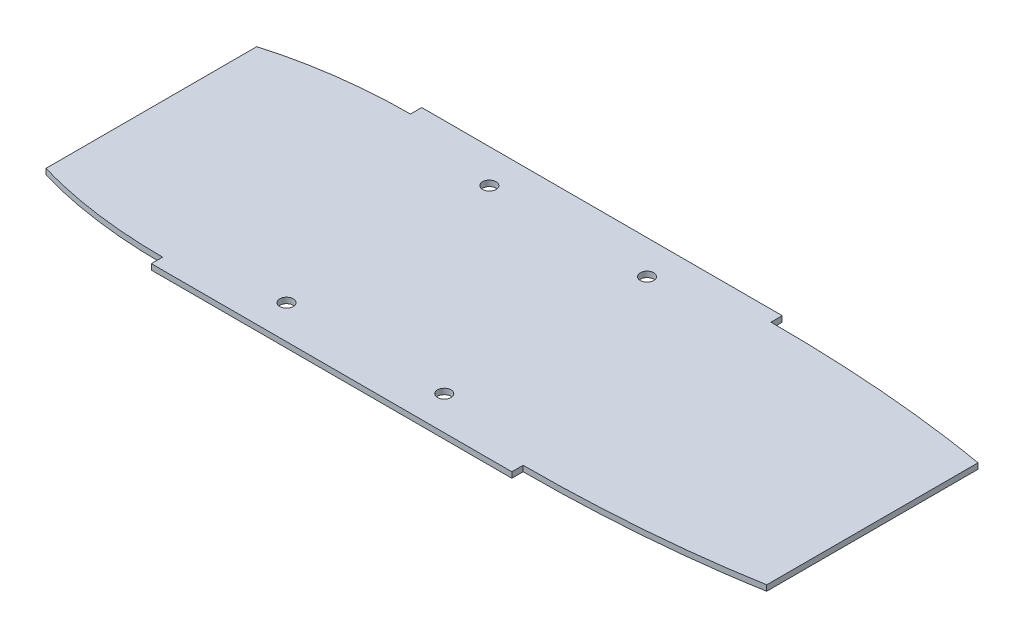
ISO-10303-21;
HEADER;
FILE_DESCRIPTION(('STEP AP214'),'2;1');
FILE_NAME('part.step','',(''),(''),'','','');
FILE_SCHEMA(('AUTOMOTIVE_DESIGN { 1 0 10303 214 1 1 1 1 }'));
ENDSEC;
DATA;
#1=APPLICATION_CONTEXT('core data for automotive mechanical design processes');
#2=APPLICATION_PROTOCOL_DEFINITION('international standard','automotive_design',2000,#1);
#3=PRODUCT_CONTEXT('',#1,'mechanical');
#4=PRODUCT('Part','Part','',(#3));
#5=PRODUCT_RELATED_PRODUCT_CATEGORY('part','',(#4));
#6=PRODUCT_DEFINITION_FORMATION('','',#4);
#7=PRODUCT_DEFINITION_CONTEXT('part definition',#1,'design');
#8=PRODUCT_DEFINITION('design','',#6,#7);
#9=PRODUCT_DEFINITION_SHAPE('','',#8);
#10=(LENGTH_UNIT() NAMED_UNIT(*) SI_UNIT(.MILLI.,.METRE.));
#11=(NAMED_UNIT(*) PLANE_ANGLE_UNIT() SI_UNIT($,.RADIAN.));
#12=(NAMED_UNIT(*) SI_UNIT($,.STERADIAN.) SOLID_ANGLE_UNIT());
#13=UNCERTAINTY_MEASURE_WITH_UNIT(LENGTH_MEASURE(1.E-05),#10,'distance_accuracy_value','');
#14=(GEOMETRIC_REPRESENTATION_CONTEXT(3) GLOBAL_UNCERTAINTY_ASSIGNED_CONTEXT((#13)) GLOBAL_UNIT_ASSIGNED_CONTEXT((#10,
#11,#12)) REPRESENTATION_CONTEXT('',''));
#15=CARTESIAN_POINT('',(0.,0.,0.));
#16=DIRECTION('',(0.,0.,1.));
#17=DIRECTION('',(1.,0.,0.));
#18=AXIS2_PLACEMENT_3D('',#15,#16,#17);
#19=CARTESIAN_POINT('',(76.1999999999997,26.9875,-34.925));
#20=CARTESIAN_POINT('',(72.5603564632113,26.9875,-34.925));
#21=CARTESIAN_POINT('',(68.9433602687617,26.9875,-34.7925618992713));
#22=CARTESIAN_POINT('',(61.754441862427,26.9875,-34.2641001276463));
#23=CARTESIAN_POINT('',(58.1825049464731,26.9875,-33.868162443835));
#24=CARTESIAN_POINT('',(51.0865374538094,26.9875,-32.7961383290664));
#25=CARTESIAN_POINT('',(47.5624441070245,26.9875,-32.1204189676496));
#26=CARTESIAN_POINT('',(40.56908339934,26.9875,-30.4483664909969));
#27=CARTESIAN_POINT('',(37.0996317653239,26.9875,-29.4531109760018));
#28=CARTESIAN_POINT('',(32.8060272774813,26.9875,-27.956355969603));
#29=CARTESIAN_POINT('',(31.949494881953,26.9875,-27.6442069521447));
#30=CARTESIAN_POINT('',(30.2411749515847,26.9875,-26.992161717209));
#31=CARTESIAN_POINT('',(29.3909262644994,26.9875,-26.6527975495949));
#32=CARTESIAN_POINT('',(26.8661441131601,26.9875,-25.597394737503));
#33=CARTESIAN_POINT('',(25.2123734643618,26.9875,-24.8423540741429));
#34=CARTESIAN_POINT('',(21.9728214093303,26.9875,-23.213388070859));
#35=CARTESIAN_POINT('',(20.386939208928,26.9875,-22.339638977673));
#36=CARTESIAN_POINT('',(17.297386896949,26.9875,-20.4483863204334));
#37=CARTESIAN_POINT('',(15.7934781724047,26.9875,-19.431299990407));
#38=CARTESIAN_POINT('',(13.6172991220065,26.9875,-17.7663365281185));
#39=CARTESIAN_POINT('',(12.9046822744669,26.9875,-17.1874406169234));
#40=CARTESIAN_POINT('',(11.5135618934957,26.9875,-15.9764993076084));
#41=CARTESIAN_POINT('',(10.8408805125964,26.9875,-15.3495523852048));
#42=CARTESIAN_POINT('',(9.54783146962513,26.9875,-14.0465518144513));
#43=CARTESIAN_POINT('',(8.9274235452261,26.9875,-13.3705359602233));
#44=CARTESIAN_POINT('',(8.0428892774231,26.9875,-12.3132592607334));
#45=CARTESIAN_POINT('',(7.75574806179347,26.9875,-11.9536024047961));
#46=CARTESIAN_POINT('',(7.19839537483305,26.9875,-11.2183967943476));
#47=CARTESIAN_POINT('',(6.92844663374853,26.9875,-10.8430707322873));
#48=CARTESIAN_POINT('',(5.63796184227502,26.9875,-8.94213359665423));
#49=CARTESIAN_POINT('',(4.78101107586467,26.9875,-7.33176742386425));
#50=CARTESIAN_POINT('',(4.01147969438286,26.9875,-5.16471775272271));
#51=CARTESIAN_POINT('',(3.87239307522746,26.9875,-4.72142751827261));
#52=CARTESIAN_POINT('',(3.63099177501125,26.9875,-3.82846626814824));
#53=CARTESIAN_POINT('',(3.52874667724679,26.9875,-3.37975212502372));
#54=CARTESIAN_POINT('',(3.27869346703287,26.9875,-2.02674994666996));
#55=CARTESIAN_POINT('',(3.18749456265522,26.9875,-1.11561098190104));
#56=CARTESIAN_POINT('',(3.17054554415629,26.9875,0.265601808246156));
#57=CARTESIAN_POINT('',(3.18510372384195,26.9875,0.730659271986201));
#58=CARTESIAN_POINT('',(3.25443229426314,26.9875,1.65360842255518));
#59=CARTESIAN_POINT('',(3.30889651317539,26.9875,2.11072274199884));
#60=CARTESIAN_POINT('',(3.52864851104458,26.9875,3.46965448976416));
#61=CARTESIAN_POINT('',(3.75017780345977,26.9875,4.35908665502137));
#62=CARTESIAN_POINT('',(4.18515546351808,26.9875,5.67062233748688));
#63=CARTESIAN_POINT('',(4.34801748654266,26.9875,6.1056829349753));
#64=CARTESIAN_POINT('',(4.70275321201352,26.9875,6.9593140984271));
#65=CARTESIAN_POINT('',(4.89428858014908,26.9875,7.37754006923282));
#66=CARTESIAN_POINT('',(5.507317523469,26.9875,8.60892261472479));
#67=CARTESIAN_POINT('',(5.96705377573498,26.9875,9.39889305272723));
#68=CARTESIAN_POINT('',(6.97247279095451,26.9875,10.9267254547347));
#69=CARTESIAN_POINT('',(7.51823247837097,26.9875,11.6645407802393));
#70=CARTESIAN_POINT('',(8.68466075580004,26.9875,13.0947549440418));
#71=CARTESIAN_POINT('',(9.29981778787903,26.9875,13.7801786538996));
#72=CARTESIAN_POINT('',(11.2121251615962,26.9875,15.748333856865));
#73=CARTESIAN_POINT('',(12.5810595129363,26.9875,16.9509905777263));
#74=CARTESIAN_POINT('',(14.7394801665955,26.9875,18.6327806396098));
#75=CARTESIAN_POINT('',(15.4767122291943,26.9875,19.1727144085212));
#76=CARTESIAN_POINT('',(16.9829097552736,26.9875,20.2156585433375));
#77=CARTESIAN_POINT('',(17.7537573162849,26.9875,20.7197626436659));
#78=CARTESIAN_POINT('',(20.0906862626501,26.9875,22.1703092783181));
#79=CARTESIAN_POINT('',(21.6832083273336,26.9875,23.0576952616506));
#80=CARTESIAN_POINT('',(26.5434665049421,26.9875,25.5293377442829));
#81=CARTESIAN_POINT('',(29.8928013186441,26.9875,26.9255976090118));
#82=CARTESIAN_POINT('',(35.0379302371644,26.9875,28.7409215465057));
#83=CARTESIAN_POINT('',(36.7735475740316,26.9875,29.2986278984547));
#84=CARTESIAN_POINT('',(39.4049565803212,26.9875,30.070716914458));
#85=CARTESIAN_POINT('',(40.2864570684969,26.9875,30.3171837285658));
#86=CARTESIAN_POINT('',(42.0503516596852,26.9875,30.7873971555794));
#87=CARTESIAN_POINT('',(42.9337641271586,26.9875,31.0114480762167));
#88=CARTESIAN_POINT('',(47.3577772856146,26.9875,32.0792536532369));
#89=CARTESIAN_POINT('',(50.9190458063632,26.9875,32.7670544258513));
#90=CARTESIAN_POINT('',(58.0795392874728,26.9875,33.856246888046));
#91=CARTESIAN_POINT('',(61.6788220684616,26.9875,34.2572022787228));
#92=CARTESIAN_POINT('',(68.9128349065164,26.9875,34.7916374501152));
#93=CARTESIAN_POINT('',(72.5475804996293,26.9875,34.925));
#94=CARTESIAN_POINT('',(76.1999999999997,26.9875,34.925));
#95=B_SPLINE_CURVE_WITH_KNOTS('',3,(#19,#20,#21,#22,#23,#24,#25,#26,#27,#28,#29,#30,#31,#32,#33,
#34,#35,#36,#37,#38,#39,#40,#41,#42,#43,#44,#45,#46,#47,#48,#49,#50,#51,#52,#53,#54,#55,#56,#57,
#58,#59,#60,#61,#62,#63,#64,#65,#66,#67,#68,#69,#70,#71,#72,#73,#74,#75,#76,#77,#78,#79,#80,#81,
#82,#83,#84,#85,#86,#87,#88,#89,#90,#91,#92,#93,#94),.UNSPECIFIED.,.F.,.F.,(4,2,2,2,2,2,2,2,2,2,
2,2,2,2,2,2,2,2,2,2,2,2,2,2,2,2,2,2,2,2,2,2,2,2,2,2,2,4),(0.,0.0625,0.125,0.1875,0.25,0.265625,
0.28125,0.3125,0.34375,0.375,0.390625,0.40625,0.421875,0.4296875,0.4375,0.46875,0.4765625,
0.484375,0.5,0.5078125,0.515625,0.53125,0.5390625,0.546875,0.5625,0.578125,0.59375,0.625,
0.640625,0.65625,0.6875,0.75,0.78125,0.796875,0.8125,0.875,0.9375,1.),.UNSPECIFIED.);
#96=DIRECTION('',(0.,-1.,0.));
#97=VECTOR('',#96,1.);
#98=SURFACE_OF_LINEAR_EXTRUSION('',#95,#97);
#99=CARTESIAN_POINT('',(76.1999999999997,25.4,-34.925));
#100=CARTESIAN_POINT('',(72.5603564632113,25.4,-34.925));
#101=CARTESIAN_POINT('',(68.9433602687617,25.4,-34.7925618992713));
#102=CARTESIAN_POINT('',(61.754441862427,25.4,-34.2641001276463));
#103=CARTESIAN_POINT('',(58.1825049464731,25.4,-33.868162443835));
#104=CARTESIAN_POINT('',(51.0865374538094,25.4,-32.7961383290664));
#105=CARTESIAN_POINT('',(47.5624441070245,25.4,-32.1204189676496));
#106=CARTESIAN_POINT('',(42.0678176520532,25.4,-30.8067009776393));
#107=CARTESIAN_POINT('',(40.0787611646926,25.4,-30.277024160949));
#108=CARTESIAN_POINT('',(38.0999634049355,25.4,-29.6873559165939));
#109=B_SPLINE_CURVE_WITH_KNOTS('',3,(#99,#100,#101,#102,#103,#104,#105,#106,#107,#108),
.UNSPECIFIED.,.F.,.F.,(4,2,2,2,4),(0.,0.0625,0.125,0.1875,0.223211480228198),.UNSPECIFIED.);
#110=CARTESIAN_POINT('',(76.1999999999997,25.4,-34.925));
#111=VERTEX_POINT('',#110);
#112=CARTESIAN_POINT('',(38.0999999999997,25.4,-29.6872331160952));
#113=VERTEX_POINT('',#112);
#114=EDGE_CURVE('E403',#111,#113,#109,.T.);
#115=ORIENTED_EDGE('',*,*,#114,.T.);
#116=DIRECTION('',(0.,-1.,0.));
#117=VECTOR('',#116,1.);
#118=CARTESIAN_POINT('',(38.0999999999997,26.9875,-29.6873668216664));
#119=LINE('',#118,#117);
#120=CARTESIAN_POINT('',(38.0999999980856,26.9875,-29.6871628381416));
#121=VERTEX_POINT('',#120);
#122=EDGE_CURVE('E11',#113,#121,#119,.F.);
#123=ORIENTED_EDGE('',*,*,#122,.T.);
#124=CARTESIAN_POINT('',(38.0999627774147,26.9875,-29.6873557295969));
#125=CARTESIAN_POINT('',(40.0787607441765,26.9875,-30.2770240489674));
#126=CARTESIAN_POINT('',(42.0678174408555,26.9875,-30.8067009271438));
#127=CARTESIAN_POINT('',(47.5624441070245,26.9875,-32.1204189676496));
#128=CARTESIAN_POINT('',(51.0865374538094,26.9875,-32.7961383290664));
#129=CARTESIAN_POINT('',(58.1825049464731,26.9875,-33.868162443835));
#130=CARTESIAN_POINT('',(61.754441862427,26.9875,-34.2641001276463));
#131=CARTESIAN_POINT('',(68.9433602687617,26.9875,-34.7925618992713));
#132=CARTESIAN_POINT('',(72.5603564632113,26.9875,-34.925));
#133=CARTESIAN_POINT('',(76.1999999999997,26.9875,-34.925));
#134=B_SPLINE_CURVE_WITH_KNOTS('',3,(#124,#125,#126,#127,#128,#129,#130,#131,#132,#133),
.UNSPECIFIED.,.F.,.F.,(4,2,2,2,4),(0.,0.0357114840031659,0.098211484003166,0.160711484003166,
0.223211484003166),.UNSPECIFIED.);
#135=CARTESIAN_POINT('',(76.1999999999997,26.9875,-34.925));
#136=VERTEX_POINT('',#135);
#137=EDGE_CURVE('E390',#136,#121,#134,.F.);
#138=ORIENTED_EDGE('',*,*,#137,.F.);
#139=DIRECTION('',(0.,-1.,0.));
#140=VECTOR('',#139,1.);
#141=CARTESIAN_POINT('',(76.1999999999997,26.9875,-34.925));
#142=LINE('',#141,#140);
#143=EDGE_CURVE('E218',#136,#111,#142,.T.);
#144=ORIENTED_EDGE('',*,*,#143,.T.);
#145=EDGE_LOOP('',(#115,#123,#138,#144));
#146=FACE_BOUND('',#145,.T.);
#147=ADVANCED_FACE('F41',(#146),#98,.F.);
#148=CARTESIAN_POINT('',(177.8,26.9875,34.925));
#149=CARTESIAN_POINT('',(183.40370840029,26.9875,34.925));
#150=CARTESIAN_POINT('',(188.998492342091,26.9875,34.8134012686547));
#151=CARTESIAN_POINT('',(200.169898566388,26.9875,34.3630955572989));
#152=CARTESIAN_POINT('',(205.746528757201,26.9875,34.0244874693774));
#153=CARTESIAN_POINT('',(216.88025562911,26.9875,33.1030083047877));
#154=CARTESIAN_POINT('',(222.437375795057,26.9875,32.5204309019362));
#155=CARTESIAN_POINT('',(230.756257159578,26.9875,31.4364978015171));
#156=CARTESIAN_POINT('',(233.526404303454,26.9875,31.0400068257652));
#157=CARTESIAN_POINT('',(239.060480939295,26.9875,30.1692742671898));
#158=CARTESIAN_POINT('',(241.826062226285,26.9875,29.6947144052508));
#159=CARTESIAN_POINT('',(250.088902803076,26.9875,28.1436304406752));
#160=CARTESIAN_POINT('',(255.558584052763,26.9875,26.9422744616829));
#161=CARTESIAN_POINT('',(262.328557631232,26.9875,25.151722447159));
#162=CARTESIAN_POINT('',(263.679135198158,26.9875,24.7789077819295));
#163=CARTESIAN_POINT('',(266.372677583537,26.9875,24.0005201906466));
#164=CARTESIAN_POINT('',(267.716821630011,26.9875,23.5945739067691));
#165=CARTESIAN_POINT('',(271.725857041584,26.9875,22.3245800424065));
#166=CARTESIAN_POINT('',(274.367439530104,26.9875,21.4093876064713));
#167=CARTESIAN_POINT('',(279.569151408405,26.9875,19.3995631096485));
#168=CARTESIAN_POINT('',(282.129804396612,26.9875,18.3060845261203));
#169=CARTESIAN_POINT('',(285.882964579781,26.9875,16.4724024076561));
#170=CARTESIAN_POINT('',(287.119225285846,26.9875,15.8285870242359));
#171=CARTESIAN_POINT('',(289.553724570188,26.9875,14.4571942341488));
#172=CARTESIAN_POINT('',(290.75211294571,26.9875,13.729946827958));
#173=CARTESIAN_POINT('',(293.096789788384,26.9875,12.1606769098726));
#174=CARTESIAN_POINT('',(294.246150852308,26.9875,11.3161373275131));
#175=CARTESIAN_POINT('',(295.874693946631,26.9875,9.95117365154913));
#176=CARTESIAN_POINT('',(296.402758108851,26.9875,9.47890107028839));
#177=CARTESIAN_POINT('',(297.421867433967,26.9875,8.49107384687561));
#178=CARTESIAN_POINT('',(297.913370928572,26.9875,7.97472076560551));
#179=CARTESIAN_POINT('',(298.834097865123,26.9875,6.90284501572136));
#180=CARTESIAN_POINT('',(299.265206404791,26.9875,6.34585567960606));
#181=CARTESIAN_POINT('',(300.051083084041,26.9875,5.17694346130733));
#182=CARTESIAN_POINT('',(300.406626858853,26.9875,4.56434570485596));
#183=CARTESIAN_POINT('',(301.008906585507,26.9875,3.2658774791787));
#184=CARTESIAN_POINT('',(301.246986609035,26.9875,2.59779289203812));
#185=CARTESIAN_POINT('',(301.485043085,26.9875,1.56007434835118));
#186=CARTESIAN_POINT('',(301.544634961144,26.9875,1.20611376411271));
#187=CARTESIAN_POINT('',(301.61783011653,26.9875,0.494585391032958));
#188=CARTESIAN_POINT('',(301.644885041487,26.9875,-0.214202136822748));
#189=CARTESIAN_POINT('',(301.58142305175,26.9875,-0.917612733288204));
#190=CARTESIAN_POINT('',(301.474094585222,26.9875,-1.61841755118926));
#191=CARTESIAN_POINT('',(301.397802991621,26.9875,-1.96980161308525));
#192=CARTESIAN_POINT('',(301.111287523074,26.9875,-3.00150338244735));
#193=CARTESIAN_POINT('',(300.846416268115,26.9875,-3.65704054032108));
#194=CARTESIAN_POINT('',(300.206739898206,26.9875,-4.92009342119564));
#195=CARTESIAN_POINT('',(299.828668716882,26.9875,-5.53104392505531));
#196=CARTESIAN_POINT('',(299.007148253441,26.9875,-6.68638382324302));
#197=CARTESIAN_POINT('',(298.562585264128,26.9875,-7.23408209409014));
#198=CARTESIAN_POINT('',(297.622788001943,26.9875,-8.28455024782695));
#199=CARTESIAN_POINT('',(297.12740422262,26.9875,-8.78718756877281));
#200=CARTESIAN_POINT('',(296.096077791606,26.9875,-9.75650013066857));
#201=CARTESIAN_POINT('',(295.558527194094,26.9875,-10.22423915677));
#202=CARTESIAN_POINT('',(293.916424424212,26.9875,-11.5661588413414));
#203=CARTESIAN_POINT('',(292.777517595788,26.9875,-12.3858483534018));
#204=CARTESIAN_POINT('',(290.439906755949,26.9875,-13.9237998549299));
#205=CARTESIAN_POINT('',(289.240807105044,26.9875,-14.6413907637318));
#206=CARTESIAN_POINT('',(286.797257835421,26.9875,-15.9996503141842));
#207=CARTESIAN_POINT('',(285.552669877377,26.9875,-16.6400843057307));
#208=CARTESIAN_POINT('',(283.027180156828,26.9875,-17.8593570925605));
#209=CARTESIAN_POINT('',(281.744712958145,26.9875,-18.4387322654086));
#210=CARTESIAN_POINT('',(279.156163214264,26.9875,-19.543403236427));
#211=CARTESIAN_POINT('',(277.854905585361,26.9875,-20.0667037940368));
#212=CARTESIAN_POINT('',(273.933809614949,26.9875,-21.5645745356882));
#213=CARTESIAN_POINT('',(271.296832059148,26.9875,-22.4678783339887));
#214=CARTESIAN_POINT('',(265.988924803845,26.9875,-24.1333098808428));
#215=CARTESIAN_POINT('',(263.317871138284,26.9875,-24.8949221674372));
#216=CARTESIAN_POINT('',(255.263773485536,26.9875,-27.0095407504629));
#217=CARTESIAN_POINT('',(249.840327560234,26.9875,-28.194552175184));
#218=CARTESIAN_POINT('',(238.914613399224,26.9875,-30.2368248091202));
#219=CARTESIAN_POINT('',(233.411910816065,26.9875,-31.0922799627863));
#220=CARTESIAN_POINT('',(225.10878593395,26.9875,-32.1714210563456));
#221=CARTESIAN_POINT('',(222.333695525846,26.9875,-32.4966399737648));
#222=CARTESIAN_POINT('',(216.783621707619,26.9875,-33.0815336608464));
#223=CARTESIAN_POINT('',(214.006661760514,26.9875,-33.3414621593897));
#224=CARTESIAN_POINT('',(205.67035735836,26.9875,-34.0295189727522));
#225=CARTESIAN_POINT('',(200.105614732871,26.9875,-34.3663648638733));
#226=CARTESIAN_POINT('',(188.962770447655,26.9875,-34.8141569570662));
#227=CARTESIAN_POINT('',(183.384662687404,26.9875,-34.925));
#228=CARTESIAN_POINT('',(177.8,26.9875,-34.925));
#229=B_SPLINE_CURVE_WITH_KNOTS('',3,(#148,#149,#150,#151,#152,#153,#154,#155,#156,#157,#158,
#159,#160,#161,#162,#163,#164,#165,#166,#167,#168,#169,#170,#171,#172,#173,#174,#175,#176,#177,
#178,#179,#180,#181,#182,#183,#184,#185,#186,#187,#188,#189,#190,#191,#192,#193,#194,#195,#196,
#197,#198,#199,#200,#201,#202,#203,#204,#205,#206,#207,#208,#209,#210,#211,#212,#213,#214,#215,
#216,#217,#218,#219,#220,#221,#222,#223,#224,#225,#226,#227,#228),.UNSPECIFIED.,.F.,.F.,(4,2,2,
2,2,2,2,2,2,2,2,2,2,2,2,2,2,2,2,2,1,2,2,2,2,2,2,2,2,2,2,2,2,2,2,2,2,2,2,2,4),(0.,0.0625,0.125,
0.1875,0.21875,0.25,0.312499999999999,0.328124999999999,0.343749999999999,0.374999999999999,
0.406249999999999,0.421874999999999,0.4375,0.453125,0.4609375,0.468749999999999,
0.476562499999999,0.484374999999999,0.492187499999999,0.496093749999999,0.499999999999999,
0.503906249999999,0.507812499999998,0.515624999999998,0.523437499999998,0.531249999999998,
0.539062499999998,0.546874999999997,0.562499999999997,0.578124999999998,0.593749999999998,
0.609374999999998,0.624999999999998,0.656249999999998,0.687499999999998,0.749999999999999,
0.812499999999999,0.843749999999999,0.875,0.9375,1.),.UNSPECIFIED.);
#230=DIRECTION('',(0.,-1.,0.));
#231=VECTOR('',#230,1.);
#232=SURFACE_OF_LINEAR_EXTRUSION('',#229,#231);
#233=CARTESIAN_POINT('',(177.8,25.4,34.925));
#234=CARTESIAN_POINT('',(183.40370840029,25.4,34.925));
#235=CARTESIAN_POINT('',(188.998492342091,25.4,34.8134012686547));
#236=CARTESIAN_POINT('',(200.169898566388,25.4,34.3630955572989));
#237=CARTESIAN_POINT('',(205.746528757201,25.4,34.0244874693774));
#238=CARTESIAN_POINT('',(216.88025562911,25.4,33.1030083047877));
#239=CARTESIAN_POINT('',(222.437375795057,25.4,32.5204309019362));
#240=CARTESIAN_POINT('',(230.756257159578,25.4,31.4364978015171));
#241=CARTESIAN_POINT('',(233.526404303454,25.4,31.0400068257652));
#242=CARTESIAN_POINT('',(237.963545467979,25.4,30.3418662807057));
#243=CARTESIAN_POINT('',(239.633117521986,25.4,30.0648138942086));
#244=CARTESIAN_POINT('',(241.29999427862,25.4,29.7727633829904));
#245=B_SPLINE_CURVE_WITH_KNOTS('',3,(#233,#234,#235,#236,#237,#238,#239,#240,#241,#242,#243,
#244),.UNSPECIFIED.,.F.,.F.,(4,2,2,2,2,4),(0.,0.0625,0.125,0.1875,0.21875,0.237611579768657),.UNSPECIFIED.);
#246=CARTESIAN_POINT('',(177.8,25.4,34.925));
#247=VERTEX_POINT('',#246);
#248=CARTESIAN_POINT('',(241.3,25.4,29.7727960401112));
#249=VERTEX_POINT('',#248);
#250=EDGE_CURVE('E145',#247,#249,#245,.T.);
#251=ORIENTED_EDGE('',*,*,#250,.T.);
#252=DIRECTION('',(0.,-1.,0.));
#253=VECTOR('',#252,1.);
#254=CARTESIAN_POINT('',(241.3,26.9875,29.7727623805576));
#255=LINE('',#254,#253);
#256=CARTESIAN_POINT('',(241.300000000617,26.9875,29.7728081533494));
#257=VERTEX_POINT('',#256);
#258=EDGE_CURVE('E130',#249,#257,#255,.F.);
#259=ORIENTED_EDGE('',*,*,#258,.T.);
#260=CARTESIAN_POINT('',(241.299994813956,26.9875,29.7727632891952));
#261=CARTESIAN_POINT('',(239.633117879454,26.9875,30.0648138348896));
#262=CARTESIAN_POINT('',(237.96354564677,26.9875,30.3418662525748));
#263=CARTESIAN_POINT('',(233.526404303454,26.9875,31.0400068257652));
#264=CARTESIAN_POINT('',(230.756257159578,26.9875,31.4364978015171));
#265=CARTESIAN_POINT('',(222.437375795057,26.9875,32.5204309019362));
#266=CARTESIAN_POINT('',(216.88025562911,26.9875,33.1030083047877));
#267=CARTESIAN_POINT('',(205.746528757201,26.9875,34.0244874693774));
#268=CARTESIAN_POINT('',(200.169898566388,26.9875,34.3630955572989));
#269=CARTESIAN_POINT('',(188.998492342091,26.9875,34.8134012686547));
#270=CARTESIAN_POINT('',(183.40370840029,26.9875,34.925));
#271=CARTESIAN_POINT('',(177.8,26.9875,34.925));
#272=B_SPLINE_CURVE_WITH_KNOTS('',3,(#260,#261,#262,#263,#264,#265,#266,#267,#268,#269,#270,
#271),.UNSPECIFIED.,.F.,.F.,(4,2,2,2,2,4),(0.,0.0188615817878592,0.0501115817878591,
0.112611581787859,0.175111581787859,0.237611581787859),.UNSPECIFIED.);
#273=CARTESIAN_POINT('',(177.8,26.9875,34.925));
#274=VERTEX_POINT('',#273);
#275=EDGE_CURVE('E221',#274,#257,#272,.F.);
#276=ORIENTED_EDGE('',*,*,#275,.F.);
#277=DIRECTION('',(0.,-1.,0.));
#278=VECTOR('',#277,1.);
#279=CARTESIAN_POINT('',(177.8,26.9875,34.925));
#280=LINE('',#279,#278);
#281=EDGE_CURVE('E157',#274,#247,#280,.T.);
#282=ORIENTED_EDGE('',*,*,#281,.T.);
#283=EDGE_LOOP('',(#251,#259,#276,#282));
#284=FACE_BOUND('',#283,.T.);
#285=ADVANCED_FACE('F155',(#284),#232,.F.);
#286=CARTESIAN_POINT('',(76.1999999999997,25.4,-38.1));
#287=DIRECTION('',(0.,0.,1.));
#288=DIRECTION('',(1.,0.,0.));
#289=AXIS2_PLACEMENT_3D('',#286,#287,#288);
#290=PLANE('',#289);
#291=DIRECTION('',(1.,0.,0.));
#292=VECTOR('',#291,1.);
#293=CARTESIAN_POINT('',(76.1999999999997,25.4,-38.1));
#294=LINE('',#293,#292);
#295=CARTESIAN_POINT('',(76.1999999999997,25.4,-38.1));
#296=VERTEX_POINT('',#295);
#297=CARTESIAN_POINT('',(177.8,25.4,-38.1));
#298=VERTEX_POINT('',#297);
#299=EDGE_CURVE('E328',#296,#298,#294,.T.);
#300=ORIENTED_EDGE('',*,*,#299,.F.);
#301=DIRECTION('',(0.,-1.,0.));
#302=VECTOR('',#301,1.);
#303=CARTESIAN_POINT('',(76.1999999999997,26.9875,-38.1));
#304=LINE('',#303,#302);
#305=CARTESIAN_POINT('',(76.1999999999997,26.9875,-38.1));
#306=VERTEX_POINT('',#305);
#307=EDGE_CURVE('E214',#306,#296,#304,.T.);
#308=ORIENTED_EDGE('',*,*,#307,.F.);
#309=DIRECTION('',(-1.,0.,0.));
#310=VECTOR('',#309,1.);
#311=CARTESIAN_POINT('',(76.1999999999997,26.9875,-38.1));
#312=LINE('',#311,#310);
#313=CARTESIAN_POINT('',(177.799999999998,26.9875,-38.1));
#314=VERTEX_POINT('',#313);
#315=EDGE_CURVE('E291',#314,#306,#312,.T.);
#316=ORIENTED_EDGE('',*,*,#315,.F.);
#317=DIRECTION('',(0.,-1.,0.));
#318=VECTOR('',#317,1.);
#319=CARTESIAN_POINT('',(177.799999999998,26.9875,-38.1));
#320=LINE('',#319,#318);
#321=EDGE_CURVE('E196',#314,#298,#320,.T.);
#322=ORIENTED_EDGE('',*,*,#321,.T.);
#323=EDGE_LOOP('',(#300,#308,#316,#322));
#324=FACE_BOUND('',#323,.T.);
#325=ADVANCED_FACE('F43',(#324),#290,.F.);
#326=CARTESIAN_POINT('',(76.1999999999997,25.4,38.1));
#327=DIRECTION('',(0.,0.,-1.));
#328=DIRECTION('',(-1.,0.,0.));
#329=AXIS2_PLACEMENT_3D('',#326,#327,#328);
#330=PLANE('',#329);
#331=DIRECTION('',(-1.,0.,0.));
#332=VECTOR('',#331,1.);
#333=CARTESIAN_POINT('',(76.1999999999997,25.4,38.1));
#334=LINE('',#333,#332);
#335=CARTESIAN_POINT('',(177.8,25.4,38.1));
#336=VERTEX_POINT('',#335);
#337=CARTESIAN_POINT('',(76.1999999999997,25.4,38.1));
#338=VERTEX_POINT('',#337);
#339=EDGE_CURVE('E334',#336,#338,#334,.T.);
#340=ORIENTED_EDGE('',*,*,#339,.F.);
#341=DIRECTION('',(0.,-1.,0.));
#342=VECTOR('',#341,1.);
#343=CARTESIAN_POINT('',(177.8,26.9875,38.1));
#344=LINE('',#343,#342);
#345=CARTESIAN_POINT('',(177.8,26.9875,38.1));
#346=VERTEX_POINT('',#345);
#347=EDGE_CURVE('E205',#346,#336,#344,.T.);
#348=ORIENTED_EDGE('',*,*,#347,.F.);
#349=DIRECTION('',(1.,0.,0.));
#350=VECTOR('',#349,1.);
#351=CARTESIAN_POINT('',(76.1999999999997,26.9875,38.1));
#352=LINE('',#351,#350);
#353=CARTESIAN_POINT('',(76.1999999999997,26.9875,38.1));
#354=VERTEX_POINT('',#353);
#355=EDGE_CURVE('E194',#354,#346,#352,.T.);
#356=ORIENTED_EDGE('',*,*,#355,.F.);
#357=DIRECTION('',(0.,-1.,0.));
#358=VECTOR('',#357,1.);
#359=CARTESIAN_POINT('',(76.1999999999997,26.9875,38.1));
#360=LINE('',#359,#358);
#361=EDGE_CURVE('E209',#354,#338,#360,.T.);
#362=ORIENTED_EDGE('',*,*,#361,.T.);
#363=EDGE_LOOP('',(#340,#348,#356,#362));
#364=FACE_BOUND('',#363,.T.);
#365=ADVANCED_FACE('F474',(#364),#330,.F.);
#366=CARTESIAN_POINT('',(301.622255812814,25.4,-0.212857903975557));
#367=DIRECTION('',(0.,-1.,0.));
#368=DIRECTION('',(0.,0.,-1.));
#369=AXIS2_PLACEMENT_3D('',#366,#367,#368);
#370=PLANE('',#369);
#371=DIRECTION('',(0.,0.,1.));
#372=VECTOR('',#371,1.);
#373=CARTESIAN_POINT('',(38.0999999999997,25.4,39.0174953769947));
#374=LINE('',#373,#372);
#375=CARTESIAN_POINT('',(38.0999999879631,25.4,29.6869870060322));
#376=VERTEX_POINT('',#375);
#377=EDGE_CURVE('E58',#113,#376,#374,.T.);
#378=ORIENTED_EDGE('',*,*,#377,.F.);
#379=ORIENTED_EDGE('',*,*,#114,.F.);
#380=DIRECTION('',(0.,0.,1.));
#381=VECTOR('',#380,1.);
#382=CARTESIAN_POINT('',(76.1999999999997,25.4,-34.925));
#383=LINE('',#382,#381);
#384=EDGE_CURVE('E307',#296,#111,#383,.T.);
#385=ORIENTED_EDGE('',*,*,#384,.F.);
#386=ORIENTED_EDGE('',*,*,#299,.T.);
#387=DIRECTION('',(-4.28353765406556E-13,0.,-1.));
#388=VECTOR('',#387,1.);
#389=CARTESIAN_POINT('',(177.799999999998,25.4,-38.1));
#390=LINE('',#389,#388);
#391=CARTESIAN_POINT('',(177.8,25.4,-34.925));
#392=VERTEX_POINT('',#391);
#393=EDGE_CURVE('E159',#392,#298,#390,.T.);
#394=ORIENTED_EDGE('',*,*,#393,.F.);
#395=CARTESIAN_POINT('',(241.30000540253,25.4,-29.7728782677569));
#396=CARTESIAN_POINT('',(236.849646423319,25.4,-30.5528839762175));
#397=CARTESIAN_POINT('',(232.373867771105,25.4,-31.227192411124));
#398=CARTESIAN_POINT('',(225.10878593395,25.4,-32.1714210563456));
#399=CARTESIAN_POINT('',(222.333695525846,25.4,-32.4966399737648));
#400=CARTESIAN_POINT('',(216.783621707619,25.4,-33.0815336608464));
#401=CARTESIAN_POINT('',(214.006661760514,25.4,-33.3414621593897));
#402=CARTESIAN_POINT('',(205.67035735836,25.4,-34.0295189727522));
#403=CARTESIAN_POINT('',(200.105614732871,25.4,-34.3663648638733));
#404=CARTESIAN_POINT('',(188.962770447655,25.4,-34.8141569570662));
#405=CARTESIAN_POINT('',(183.384662687404,25.4,-34.925));
#406=CARTESIAN_POINT('',(177.8,25.4,-34.925));
#407=B_SPLINE_CURVE_WITH_KNOTS('',3,(#395,#396,#397,#398,#399,#400,#401,#402,#403,#404,#405,
#406),.UNSPECIFIED.,.F.,.F.,(4,2,2,2,2,4),(0.761720471129442,0.812499999999999,
0.843749999999999,0.875,0.9375,1.),.UNSPECIFIED.);
#408=CARTESIAN_POINT('',(241.300000001252,25.4,-29.7728474452461));
#409=VERTEX_POINT('',#408);
#410=EDGE_CURVE('E149',#409,#392,#407,.T.);
#411=ORIENTED_EDGE('',*,*,#410,.F.);
#412=DIRECTION('',(0.,0.,-1.));
#413=VECTOR('',#412,1.);
#414=CARTESIAN_POINT('',(241.3,25.4,44.8802496234933));
#415=LINE('',#414,#413);
#416=EDGE_CURVE('E66',#249,#409,#415,.T.);
#417=ORIENTED_EDGE('',*,*,#416,.F.);
#418=ORIENTED_EDGE('',*,*,#250,.F.);
#419=DIRECTION('',(0.,0.,-1.));
#420=VECTOR('',#419,1.);
#421=CARTESIAN_POINT('',(177.8,25.4,38.1));
#422=LINE('',#421,#420);
#423=EDGE_CURVE('E168',#336,#247,#422,.T.);
#424=ORIENTED_EDGE('',*,*,#423,.F.);
#425=ORIENTED_EDGE('',*,*,#339,.T.);
#426=DIRECTION('',(0.,0.,1.));
#427=VECTOR('',#426,1.);
#428=CARTESIAN_POINT('',(76.1999999999997,25.4,34.925));
#429=LINE('',#428,#427);
#430=CARTESIAN_POINT('',(76.1999999999997,25.4,34.925));
#431=VERTEX_POINT('',#430);
#432=EDGE_CURVE('E400',#431,#338,#429,.T.);
#433=ORIENTED_EDGE('',*,*,#432,.F.);
#434=CARTESIAN_POINT('',(38.1000344607684,25.4,29.6868713093529));
#435=CARTESIAN_POINT('',(38.2425055600034,25.4,29.7293182352077));
#436=CARTESIAN_POINT('',(38.3851011658191,25.4,29.7714783082335));
#437=CARTESIAN_POINT('',(39.4049565803212,25.4,30.070716914458));
#438=CARTESIAN_POINT('',(40.2864570684969,25.4,30.3171837285658));
#439=CARTESIAN_POINT('',(42.0503516596852,25.4,30.7873971555794));
#440=CARTESIAN_POINT('',(42.9337641271586,25.4,31.0114480762167));
#441=CARTESIAN_POINT('',(47.3577772856146,25.4,32.0792536532369));
#442=CARTESIAN_POINT('',(50.9190458063632,25.4,32.7670544258513));
#443=CARTESIAN_POINT('',(58.0795392874728,25.4,33.856246888046));
#444=CARTESIAN_POINT('',(61.6788220684616,25.4,34.2572022787228));
#445=CARTESIAN_POINT('',(68.9128349065164,25.4,34.7916374501152));
#446=CARTESIAN_POINT('',(72.5475804996293,25.4,34.925));
#447=CARTESIAN_POINT('',(76.1999999999997,25.4,34.925));
#448=B_SPLINE_CURVE_WITH_KNOTS('',3,(#434,#435,#436,#437,#438,#439,#440,#441,#442,#443,#444,
#445,#446,#447),.UNSPECIFIED.,.F.,.F.,(4,2,2,2,2,2,4),(0.778707652225282,0.78125,0.796875,
0.8125,0.875,0.9375,1.),.UNSPECIFIED.);
#449=EDGE_CURVE('E407',#376,#431,#448,.T.);
#450=ORIENTED_EDGE('',*,*,#449,.F.);
#451=EDGE_LOOP('',(#378,#379,#385,#386,#394,#411,#417,#418,#424,#425,#433,#450));
#452=FACE_BOUND('',#451,.T.);
#453=CARTESIAN_POINT('',(104.775,25.4,-28.575));
#454=DIRECTION('',(0.,1.,0.));
#455=DIRECTION('',(0.,0.,1.));
#456=AXIS2_PLACEMENT_3D('',#453,#454,#455);
#457=CIRCLE('',#456,1.89864999999999);
#458=CARTESIAN_POINT('',(104.775,25.4,-26.67635));
#459=VERTEX_POINT('',#458);
#460=EDGE_CURVE('E324',#459,#459,#457,.T.);
#461=ORIENTED_EDGE('',*,*,#460,.T.);
#462=EDGE_LOOP('',(#461));
#463=FACE_BOUND('',#462,.T.);
#464=CARTESIAN_POINT('',(104.775,25.4,28.575));
#465=DIRECTION('',(0.,1.,0.));
#466=DIRECTION('',(0.,0.,1.));
#467=AXIS2_PLACEMENT_3D('',#464,#465,#466);
#468=CIRCLE('',#467,1.89864999999999);
#469=CARTESIAN_POINT('',(104.775,25.4,30.47365));
#470=VERTEX_POINT('',#469);
#471=EDGE_CURVE('E316',#470,#470,#468,.T.);
#472=ORIENTED_EDGE('',*,*,#471,.T.);
#473=EDGE_LOOP('',(#472));
#474=FACE_BOUND('',#473,.T.);
#475=CARTESIAN_POINT('',(149.225,25.4,28.575));
#476=DIRECTION('',(0.,1.,0.));
#477=DIRECTION('',(0.,0.,1.));
#478=AXIS2_PLACEMENT_3D('',#475,#476,#477);
#479=CIRCLE('',#478,1.89865000000001);
#480=CARTESIAN_POINT('',(149.225,25.4,30.47365));
#481=VERTEX_POINT('',#480);
#482=EDGE_CURVE('E308',#481,#481,#479,.T.);
#483=ORIENTED_EDGE('',*,*,#482,.T.);
#484=EDGE_LOOP('',(#483));
#485=FACE_BOUND('',#484,.T.);
#486=CARTESIAN_POINT('',(149.225,25.4,-28.575));
#487=DIRECTION('',(0.,1.,0.));
#488=DIRECTION('',(0.,0.,1.));
#489=AXIS2_PLACEMENT_3D('',#486,#487,#488);
#490=CIRCLE('',#489,1.89865000000001);
#491=CARTESIAN_POINT('',(149.225,25.4,-26.67635));
#492=VERTEX_POINT('',#491);
#493=EDGE_CURVE('E298',#492,#492,#490,.T.);
#494=ORIENTED_EDGE('',*,*,#493,.T.);
#495=EDGE_LOOP('',(#494));
#496=FACE_BOUND('',#495,.T.);
#497=ADVANCED_FACE('F143',(#452,#463,#474,#485,#496),#370,.T.);
#498=CARTESIAN_POINT('',(301.622255812814,26.9875,-0.212857903975557));
#499=DIRECTION('',(0.,-1.,0.));
#500=DIRECTION('',(0.,0.,-1.));
#501=AXIS2_PLACEMENT_3D('',#498,#499,#500);
#502=PLANE('',#501);
#503=ORIENTED_EDGE('',*,*,#137,.T.);
#504=DIRECTION('',(0.,0.,1.));
#505=VECTOR('',#504,1.);
#506=CARTESIAN_POINT('',(38.0999999999997,26.9875,-0.212857903975533));
#507=LINE('',#506,#505);
#508=CARTESIAN_POINT('',(38.099999998613,26.9875,29.6869247060222));
#509=VERTEX_POINT('',#508);
#510=EDGE_CURVE('E337',#121,#509,#507,.T.);
#511=ORIENTED_EDGE('',*,*,#510,.T.);
#512=CARTESIAN_POINT('',(76.1999999999997,26.9875,34.925));
#513=CARTESIAN_POINT('',(72.5475804996293,26.9875,34.925));
#514=CARTESIAN_POINT('',(68.9128349065164,26.9875,34.7916374501152));
#515=CARTESIAN_POINT('',(61.6788220684616,26.9875,34.2572022787228));
#516=CARTESIAN_POINT('',(58.0795392874728,26.9875,33.856246888046));
#517=CARTESIAN_POINT('',(50.9190458063632,26.9875,32.7670544258513));
#518=CARTESIAN_POINT('',(47.3577772856146,26.9875,32.0792536532369));
#519=CARTESIAN_POINT('',(42.9337641271586,26.9875,31.0114480762167));
#520=CARTESIAN_POINT('',(42.0503516596852,26.9875,30.7873971555794));
#521=CARTESIAN_POINT('',(40.2864570684969,26.9875,30.3171837285658));
#522=CARTESIAN_POINT('',(39.4049565803212,26.9875,30.070716914458));
#523=CARTESIAN_POINT('',(38.3851012923816,26.9875,29.7714783453686));
#524=CARTESIAN_POINT('',(38.2425058129095,26.9875,29.7293183099824));
#525=CARTESIAN_POINT('',(38.1000348397964,26.9875,29.686871422278));
#526=B_SPLINE_CURVE_WITH_KNOTS('',3,(#512,#513,#514,#515,#516,#517,#518,#519,#520,#521,#522,
#523,#524,#525),.UNSPECIFIED.,.F.,.F.,(4,2,2,2,2,2,4),(0.778707654479824,0.841207654479824,
0.903707654479824,0.966207654479824,0.981832654479824,0.997457654479824,1.),.UNSPECIFIED.);
#527=CARTESIAN_POINT('',(76.1999999999997,26.9875,34.925));
#528=VERTEX_POINT('',#527);
#529=EDGE_CURVE('E261',#509,#528,#526,.F.);
#530=ORIENTED_EDGE('',*,*,#529,.T.);
#531=DIRECTION('',(0.,0.,1.));
#532=VECTOR('',#531,1.);
#533=CARTESIAN_POINT('',(76.1999999999997,26.9875,34.925));
#534=LINE('',#533,#532);
#535=EDGE_CURVE('E388',#528,#354,#534,.T.);
#536=ORIENTED_EDGE('',*,*,#535,.T.);
#537=ORIENTED_EDGE('',*,*,#355,.T.);
#538=DIRECTION('',(0.,0.,-1.));
#539=VECTOR('',#538,1.);
#540=CARTESIAN_POINT('',(177.8,26.9875,38.1));
#541=LINE('',#540,#539);
#542=EDGE_CURVE('E360',#346,#274,#541,.T.);
#543=ORIENTED_EDGE('',*,*,#542,.T.);
#544=ORIENTED_EDGE('',*,*,#275,.T.);
#545=DIRECTION('',(0.,0.,-1.));
#546=VECTOR('',#545,1.);
#547=CARTESIAN_POINT('',(241.3,26.9875,-0.212857903975557));
#548=LINE('',#547,#546);
#549=CARTESIAN_POINT('',(241.299997558817,26.9875,-29.7728652816465));
#550=VERTEX_POINT('',#549);
#551=EDGE_CURVE('E133',#257,#550,#548,.T.);
#552=ORIENTED_EDGE('',*,*,#551,.T.);
#553=CARTESIAN_POINT('',(177.8,26.9875,-34.925));
#554=CARTESIAN_POINT('',(183.384662687404,26.9875,-34.925));
#555=CARTESIAN_POINT('',(188.962770447655,26.9875,-34.8141569570662));
#556=CARTESIAN_POINT('',(200.105614732871,26.9875,-34.3663648638733));
#557=CARTESIAN_POINT('',(205.67035735836,26.9875,-34.0295189727522));
#558=CARTESIAN_POINT('',(214.006661760514,26.9875,-33.3414621593897));
#559=CARTESIAN_POINT('',(216.783621707619,26.9875,-33.0815336608464));
#560=CARTESIAN_POINT('',(222.333695525846,26.9875,-32.4966399737648));
#561=CARTESIAN_POINT('',(225.10878593395,26.9875,-32.1714210563456));
#562=CARTESIAN_POINT('',(232.373865951778,26.9875,-31.2271926475784));
#563=CARTESIAN_POINT('',(236.849642802136,26.9875,-30.5528845217748));
#564=CARTESIAN_POINT('',(241.300000001605,26.9875,-29.7728792143664));
#565=B_SPLINE_CURVE_WITH_KNOTS('',3,(#553,#554,#555,#556,#557,#558,#559,#560,#561,#562,#563,
#564),.UNSPECIFIED.,.F.,.F.,(4,2,2,2,2,4),(0.761720491671338,0.824220491671338,
0.886720491671338,0.917970491671338,0.949220491671339,1.),.UNSPECIFIED.);
#566=CARTESIAN_POINT('',(177.8,26.9875,-34.925));
#567=VERTEX_POINT('',#566);
#568=EDGE_CURVE('E353',#550,#567,#565,.F.);
#569=ORIENTED_EDGE('',*,*,#568,.T.);
#570=DIRECTION('',(-4.28353765406556E-13,0.,-1.));
#571=VECTOR('',#570,1.);
#572=CARTESIAN_POINT('',(177.799999999998,26.9875,-38.1));
#573=LINE('',#572,#571);
#574=EDGE_CURVE('E204',#567,#314,#573,.T.);
#575=ORIENTED_EDGE('',*,*,#574,.T.);
#576=ORIENTED_EDGE('',*,*,#315,.T.);
#577=DIRECTION('',(0.,0.,1.));
#578=VECTOR('',#577,1.);
#579=CARTESIAN_POINT('',(76.1999999999997,26.9875,-34.925));
#580=LINE('',#579,#578);
#581=EDGE_CURVE('E273',#306,#136,#580,.T.);
#582=ORIENTED_EDGE('',*,*,#581,.T.);
#583=EDGE_LOOP('',(#503,#511,#530,#536,#537,#543,#544,#552,#569,#575,#576,#582));
#584=FACE_BOUND('',#583,.T.);
#585=CARTESIAN_POINT('',(149.225,26.9875,-28.575));
#586=DIRECTION('',(0.,1.,0.));
#587=DIRECTION('',(0.,0.,1.));
#588=AXIS2_PLACEMENT_3D('',#585,#586,#587);
#589=CIRCLE('',#588,1.89865000000001);
#590=CARTESIAN_POINT('',(149.225,26.9875,-26.67635));
#591=VERTEX_POINT('',#590);
#592=EDGE_CURVE('E302',#591,#591,#589,.T.);
#593=ORIENTED_EDGE('',*,*,#592,.F.);
#594=EDGE_LOOP('',(#593));
#595=FACE_BOUND('',#594,.T.);
#596=CARTESIAN_POINT('',(149.225,26.9875,28.575));
#597=DIRECTION('',(0.,1.,0.));
#598=DIRECTION('',(0.,0.,1.));
#599=AXIS2_PLACEMENT_3D('',#596,#597,#598);
#600=CIRCLE('',#599,1.89865000000001);
#601=CARTESIAN_POINT('',(149.225,26.9875,30.47365));
#602=VERTEX_POINT('',#601);
#603=EDGE_CURVE('E303',#602,#602,#600,.T.);
#604=ORIENTED_EDGE('',*,*,#603,.F.);
#605=EDGE_LOOP('',(#604));
#606=FACE_BOUND('',#605,.T.);
#607=CARTESIAN_POINT('',(104.775,26.9875,28.575));
#608=DIRECTION('',(0.,1.,0.));
#609=DIRECTION('',(0.,0.,1.));
#610=AXIS2_PLACEMENT_3D('',#607,#608,#609);
#611=CIRCLE('',#610,1.89864999999999);
#612=CARTESIAN_POINT('',(104.775,26.9875,30.47365));
#613=VERTEX_POINT('',#612);
#614=EDGE_CURVE('E312',#613,#613,#611,.T.);
#615=ORIENTED_EDGE('',*,*,#614,.F.);
#616=EDGE_LOOP('',(#615));
#617=FACE_BOUND('',#616,.T.);
#618=CARTESIAN_POINT('',(104.775,26.9875,-28.575));
#619=DIRECTION('',(0.,1.,0.));
#620=DIRECTION('',(0.,0.,1.));
#621=AXIS2_PLACEMENT_3D('',#618,#619,#620);
#622=CIRCLE('',#621,1.89864999999999);
#623=CARTESIAN_POINT('',(104.775,26.9875,-26.67635));
#624=VERTEX_POINT('',#623);
#625=EDGE_CURVE('E320',#624,#624,#622,.T.);
#626=ORIENTED_EDGE('',*,*,#625,.F.);
#627=EDGE_LOOP('',(#626));
#628=FACE_BOUND('',#627,.T.);
#629=ADVANCED_FACE('F227',(#584,#595,#606,#617,#628),#502,.F.);
#630=CARTESIAN_POINT('',(76.1999999999997,26.9875,-34.925));
#631=DIRECTION('',(1.,0.,0.));
#632=DIRECTION('',(0.,0.,-1.));
#633=AXIS2_PLACEMENT_3D('',#630,#631,#632);
#634=PLANE('',#633);
#635=ORIENTED_EDGE('',*,*,#384,.T.);
#636=ORIENTED_EDGE('',*,*,#143,.F.);
#637=ORIENTED_EDGE('',*,*,#581,.F.);
#638=ORIENTED_EDGE('',*,*,#307,.T.);
#639=EDGE_LOOP('',(#635,#636,#637,#638));
#640=FACE_BOUND('',#639,.T.);
#641=ADVANCED_FACE('F236',(#640),#634,.F.);
#642=ORIENTED_EDGE('',*,*,#529,.F.);
#643=DIRECTION('',(0.,-1.,0.));
#644=VECTOR('',#643,1.);
#645=CARTESIAN_POINT('',(38.0999999999997,26.9875,29.6868610423261));
#646=LINE('',#645,#644);
#647=EDGE_CURVE('E51',#509,#376,#646,.T.);
#648=ORIENTED_EDGE('',*,*,#647,.T.);
#649=ORIENTED_EDGE('',*,*,#449,.T.);
#650=DIRECTION('',(0.,-1.,0.));
#651=VECTOR('',#650,1.);
#652=CARTESIAN_POINT('',(76.1999999999997,26.9875,34.925));
#653=LINE('',#652,#651);
#654=EDGE_CURVE('E213',#528,#431,#653,.T.);
#655=ORIENTED_EDGE('',*,*,#654,.F.);
#656=EDGE_LOOP('',(#642,#648,#649,#655));
#657=FACE_BOUND('',#656,.T.);
#658=ADVANCED_FACE('F276',(#657),#98,.F.);
#659=CARTESIAN_POINT('',(76.1999999999997,26.9875,34.925));
#660=DIRECTION('',(1.,0.,0.));
#661=DIRECTION('',(0.,0.,-1.));
#662=AXIS2_PLACEMENT_3D('',#659,#660,#661);
#663=PLANE('',#662);
#664=ORIENTED_EDGE('',*,*,#432,.T.);
#665=ORIENTED_EDGE('',*,*,#361,.F.);
#666=ORIENTED_EDGE('',*,*,#535,.F.);
#667=ORIENTED_EDGE('',*,*,#654,.T.);
#668=EDGE_LOOP('',(#664,#665,#666,#667));
#669=FACE_BOUND('',#668,.T.);
#670=ADVANCED_FACE('F285',(#669),#663,.F.);
#671=CARTESIAN_POINT('',(177.8,26.9875,38.1));
#672=DIRECTION('',(-1.,0.,0.));
#673=DIRECTION('',(0.,0.,1.));
#674=AXIS2_PLACEMENT_3D('',#671,#672,#673);
#675=PLANE('',#674);
#676=ORIENTED_EDGE('',*,*,#423,.T.);
#677=ORIENTED_EDGE('',*,*,#281,.F.);
#678=ORIENTED_EDGE('',*,*,#542,.F.);
#679=ORIENTED_EDGE('',*,*,#347,.T.);
#680=EDGE_LOOP('',(#676,#677,#678,#679));
#681=FACE_BOUND('',#680,.T.);
#682=ADVANCED_FACE('F183',(#681),#675,.F.);
#683=ORIENTED_EDGE('',*,*,#568,.F.);
#684=DIRECTION('',(0.,-1.,0.));
#685=VECTOR('',#684,1.);
#686=CARTESIAN_POINT('',(241.3,26.9875,-29.7728792146477));
#687=LINE('',#686,#685);
#688=EDGE_CURVE('E139',#550,#409,#687,.T.);
#689=ORIENTED_EDGE('',*,*,#688,.T.);
#690=ORIENTED_EDGE('',*,*,#410,.T.);
#691=DIRECTION('',(0.,-1.,0.));
#692=VECTOR('',#691,1.);
#693=CARTESIAN_POINT('',(177.8,26.9875,-34.925));
#694=LINE('',#693,#692);
#695=EDGE_CURVE('E203',#567,#392,#694,.T.);
#696=ORIENTED_EDGE('',*,*,#695,.F.);
#697=EDGE_LOOP('',(#683,#689,#690,#696));
#698=FACE_BOUND('',#697,.T.);
#699=ADVANCED_FACE('F171',(#698),#232,.F.);
#700=CARTESIAN_POINT('',(177.799999999998,26.9875,-38.1));
#701=DIRECTION('',(-1.,0.,4.28353765406556E-13));
#702=DIRECTION('',(4.28353765406556E-13,0.,1.));
#703=AXIS2_PLACEMENT_3D('',#700,#701,#702);
#704=PLANE('',#703);
#705=ORIENTED_EDGE('',*,*,#393,.T.);
#706=ORIENTED_EDGE('',*,*,#321,.F.);
#707=ORIENTED_EDGE('',*,*,#574,.F.);
#708=ORIENTED_EDGE('',*,*,#695,.T.);
#709=EDGE_LOOP('',(#705,#706,#707,#708));
#710=FACE_BOUND('',#709,.T.);
#711=ADVANCED_FACE('F182',(#710),#704,.F.);
#712=CARTESIAN_POINT('',(149.225,26.9875,-28.575));
#713=DIRECTION('',(0.,-1.,0.));
#714=DIRECTION('',(0.,0.,-1.));
#715=AXIS2_PLACEMENT_3D('',#712,#713,#714);
#716=CYLINDRICAL_SURFACE('',#715,1.89865000000001);
#717=ORIENTED_EDGE('',*,*,#592,.T.);
#718=EDGE_LOOP('',(#717));
#719=FACE_BOUND('',#718,.T.);
#720=ORIENTED_EDGE('',*,*,#493,.F.);
#721=EDGE_LOOP('',(#720));
#722=FACE_BOUND('',#721,.T.);
#723=ADVANCED_FACE('F237',(#719,#722),#716,.F.);
#724=CARTESIAN_POINT('',(149.225,26.9875,28.575));
#725=DIRECTION('',(0.,-1.,0.));
#726=DIRECTION('',(0.,0.,-1.));
#727=AXIS2_PLACEMENT_3D('',#724,#725,#726);
#728=CYLINDRICAL_SURFACE('',#727,1.89865000000001);
#729=ORIENTED_EDGE('',*,*,#603,.T.);
#730=EDGE_LOOP('',(#729));
#731=FACE_BOUND('',#730,.T.);
#732=ORIENTED_EDGE('',*,*,#482,.F.);
#733=EDGE_LOOP('',(#732));
#734=FACE_BOUND('',#733,.T.);
#735=ADVANCED_FACE('F575',(#731,#734),#728,.F.);
#736=CARTESIAN_POINT('',(104.775,26.9875,28.575));
#737=DIRECTION('',(0.,-1.,0.));
#738=DIRECTION('',(0.,0.,-1.));
#739=AXIS2_PLACEMENT_3D('',#736,#737,#738);
#740=CYLINDRICAL_SURFACE('',#739,1.89864999999999);
#741=ORIENTED_EDGE('',*,*,#614,.T.);
#742=EDGE_LOOP('',(#741));
#743=FACE_BOUND('',#742,.T.);
#744=ORIENTED_EDGE('',*,*,#471,.F.);
#745=EDGE_LOOP('',(#744));
#746=FACE_BOUND('',#745,.T.);
#747=ADVANCED_FACE('F568',(#743,#746),#740,.F.);
#748=CARTESIAN_POINT('',(104.775,26.9875,-28.575));
#749=DIRECTION('',(0.,-1.,0.));
#750=DIRECTION('',(0.,0.,-1.));
#751=AXIS2_PLACEMENT_3D('',#748,#749,#750);
#752=CYLINDRICAL_SURFACE('',#751,1.89864999999999);
#753=ORIENTED_EDGE('',*,*,#625,.T.);
#754=EDGE_LOOP('',(#753));
#755=FACE_BOUND('',#754,.T.);
#756=ORIENTED_EDGE('',*,*,#460,.F.);
#757=EDGE_LOOP('',(#756));
#758=FACE_BOUND('',#757,.T.);
#759=ADVANCED_FACE('F554',(#755,#758),#752,.F.);
#760=CARTESIAN_POINT('',(241.3,26.9975,44.8802496234933));
#761=DIRECTION('',(-1.,0.,0.));
#762=DIRECTION('',(0.,0.,1.));
#763=AXIS2_PLACEMENT_3D('',#760,#761,#762);
#764=PLANE('',#763);
#765=ORIENTED_EDGE('',*,*,#416,.T.);
#766=ORIENTED_EDGE('',*,*,#688,.F.);
#767=ORIENTED_EDGE('',*,*,#551,.F.);
#768=ORIENTED_EDGE('',*,*,#258,.F.);
#769=EDGE_LOOP('',(#765,#766,#767,#768));
#770=FACE_BOUND('',#769,.T.);
#771=ADVANCED_FACE('F131',(#770),#764,.F.);
#772=CARTESIAN_POINT('',(38.0999999999997,26.9975,39.0174953769947));
#773=DIRECTION('',(1.,0.,0.));
#774=DIRECTION('',(0.,0.,-1.));
#775=AXIS2_PLACEMENT_3D('',#772,#773,#774);
#776=PLANE('',#775);
#777=ORIENTED_EDGE('',*,*,#377,.T.);
#778=ORIENTED_EDGE('',*,*,#647,.F.);
#779=ORIENTED_EDGE('',*,*,#510,.F.);
#780=ORIENTED_EDGE('',*,*,#122,.F.);
#781=EDGE_LOOP('',(#777,#778,#779,#780));
#782=FACE_BOUND('',#781,.T.);
#783=ADVANCED_FACE('F449',(#782),#776,.F.);
#784=CLOSED_SHELL('',(#147,#285,#325,#365,#497,#629,#641,#658,#670,#682,#699,#711,#723,#735,
#747,#759,#771,#783));
#785=MANIFOLD_SOLID_BREP('B2',#784);
#786=ADVANCED_BREP_SHAPE_REPRESENTATION('',(#18,#785),#14);
#787=SHAPE_DEFINITION_REPRESENTATION(#9,#786);
ENDSEC;
END-ISO-10303-21;
